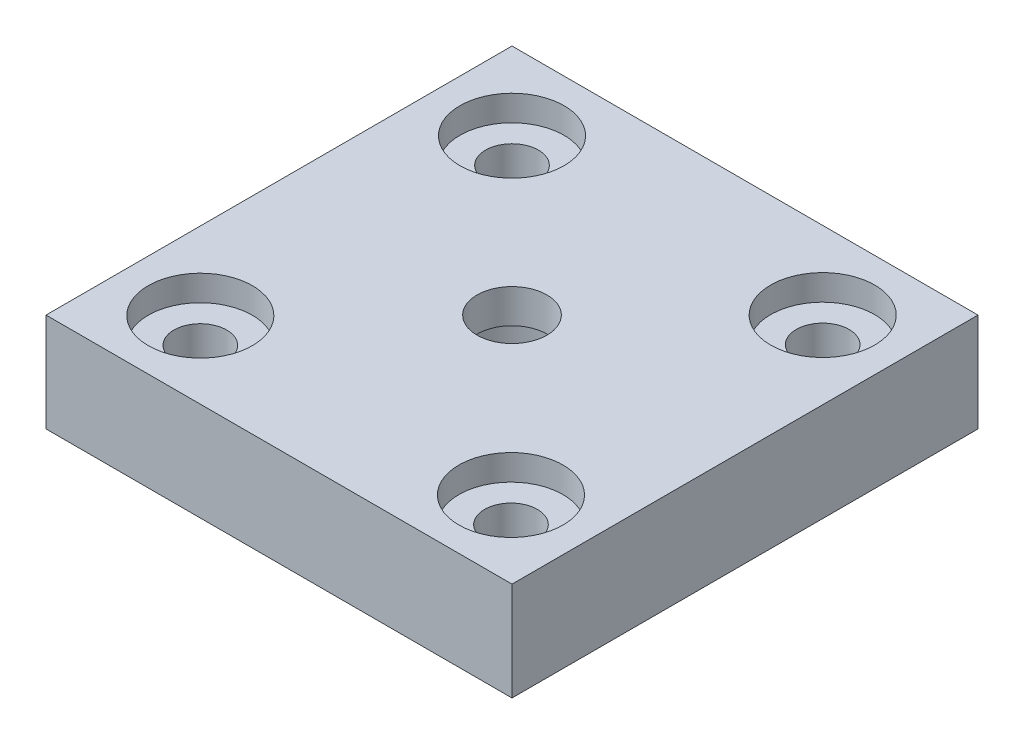
ISO-10303-21;
HEADER;
FILE_DESCRIPTION(('STEP AP214'),'2;1');
FILE_NAME('part.step','',(''),(''),'','','');
FILE_SCHEMA(('AUTOMOTIVE_DESIGN { 1 0 10303 214 1 1 1 1 }'));
ENDSEC;
DATA;
#1=APPLICATION_CONTEXT('core data for automotive mechanical design processes');
#2=APPLICATION_PROTOCOL_DEFINITION('international standard','automotive_design',2000,#1);
#3=PRODUCT_CONTEXT('',#1,'mechanical');
#4=PRODUCT('Part','Part','',(#3));
#5=PRODUCT_RELATED_PRODUCT_CATEGORY('part','',(#4));
#6=PRODUCT_DEFINITION_FORMATION('','',#4);
#7=PRODUCT_DEFINITION_CONTEXT('part definition',#1,'design');
#8=PRODUCT_DEFINITION('design','',#6,#7);
#9=PRODUCT_DEFINITION_SHAPE('','',#8);
#10=(LENGTH_UNIT() NAMED_UNIT(*) SI_UNIT(.MILLI.,.METRE.));
#11=(NAMED_UNIT(*) PLANE_ANGLE_UNIT() SI_UNIT($,.RADIAN.));
#12=(NAMED_UNIT(*) SI_UNIT($,.STERADIAN.) SOLID_ANGLE_UNIT());
#13=UNCERTAINTY_MEASURE_WITH_UNIT(LENGTH_MEASURE(1.E-05),#10,'distance_accuracy_value','');
#14=(GEOMETRIC_REPRESENTATION_CONTEXT(3) GLOBAL_UNCERTAINTY_ASSIGNED_CONTEXT((#13)) GLOBAL_UNIT_ASSIGNED_CONTEXT((#10,
#11,#12)) REPRESENTATION_CONTEXT('',''));
#15=CARTESIAN_POINT('',(0.,0.,0.));
#16=DIRECTION('',(0.,0.,1.));
#17=DIRECTION('',(1.,0.,0.));
#18=AXIS2_PLACEMENT_3D('',#15,#16,#17);
#19=CARTESIAN_POINT('',(0.,6.35,0.));
#20=DIRECTION('',(0.,-1.,0.));
#21=DIRECTION('',(0.,0.,-1.));
#22=AXIS2_PLACEMENT_3D('',#19,#20,#21);
#23=PLANE('',#22);
#24=CARTESIAN_POINT('',(0.,6.35,0.));
#25=DIRECTION('',(0.,-1.,0.));
#26=DIRECTION('',(0.,0.,-1.));
#27=AXIS2_PLACEMENT_3D('',#24,#25,#26);
#28=CIRCLE('',#27,2.2479);
#29=CARTESIAN_POINT('',(0.,6.35,-2.2479));
#30=VERTEX_POINT('',#29);
#31=EDGE_CURVE('E193',#30,#30,#28,.T.);
#32=ORIENTED_EDGE('',*,*,#31,.T.);
#33=EDGE_LOOP('',(#32));
#34=FACE_BOUND('',#33,.T.);
#35=CARTESIAN_POINT('',(10.,6.35,-10.));
#36=DIRECTION('',(0.,1.,0.));
#37=DIRECTION('',(0.,0.,1.));
#38=AXIS2_PLACEMENT_3D('',#35,#36,#37);
#39=CIRCLE('',#38,3.35);
#40=CARTESIAN_POINT('',(10.,6.35,-6.65));
#41=VERTEX_POINT('',#40);
#42=EDGE_CURVE('E173',#41,#41,#39,.T.);
#43=ORIENTED_EDGE('',*,*,#42,.F.);
#44=EDGE_LOOP('',(#43));
#45=FACE_BOUND('',#44,.T.);
#46=CARTESIAN_POINT('',(-9.99999999999979,6.35,10.066));
#47=DIRECTION('',(0.,1.,0.));
#48=DIRECTION('',(0.,0.,1.));
#49=AXIS2_PLACEMENT_3D('',#46,#47,#48);
#50=CIRCLE('',#49,3.35);
#51=CARTESIAN_POINT('',(-9.99999999999979,6.35,13.416));
#52=VERTEX_POINT('',#51);
#53=EDGE_CURVE('E141',#52,#52,#50,.T.);
#54=ORIENTED_EDGE('',*,*,#53,.F.);
#55=EDGE_LOOP('',(#54));
#56=FACE_BOUND('',#55,.T.);
#57=DIRECTION('',(0.,0.,1.));
#58=VECTOR('',#57,1.);
#59=CARTESIAN_POINT('',(-15.,6.35,15.));
#60=LINE('',#59,#58);
#61=CARTESIAN_POINT('',(-15.,6.35,-15.));
#62=VERTEX_POINT('',#61);
#63=CARTESIAN_POINT('',(-15.,6.35,15.));
#64=VERTEX_POINT('',#63);
#65=EDGE_CURVE('E92',#62,#64,#60,.T.);
#66=ORIENTED_EDGE('',*,*,#65,.T.);
#67=DIRECTION('',(1.,0.,0.));
#68=VECTOR('',#67,1.);
#69=CARTESIAN_POINT('',(-15.,6.35,15.));
#70=LINE('',#69,#68);
#71=CARTESIAN_POINT('',(15.,6.35,15.));
#72=VERTEX_POINT('',#71);
#73=EDGE_CURVE('E87',#64,#72,#70,.T.);
#74=ORIENTED_EDGE('',*,*,#73,.T.);
#75=DIRECTION('',(0.,0.,-1.));
#76=VECTOR('',#75,1.);
#77=CARTESIAN_POINT('',(15.,6.35,15.));
#78=LINE('',#77,#76);
#79=CARTESIAN_POINT('',(15.,6.35,-15.));
#80=VERTEX_POINT('',#79);
#81=EDGE_CURVE('E90',#72,#80,#78,.T.);
#82=ORIENTED_EDGE('',*,*,#81,.T.);
#83=DIRECTION('',(-1.,0.,0.));
#84=VECTOR('',#83,1.);
#85=CARTESIAN_POINT('',(-15.,6.35,-15.));
#86=LINE('',#85,#84);
#87=EDGE_CURVE('E57',#80,#62,#86,.T.);
#88=ORIENTED_EDGE('',*,*,#87,.T.);
#89=EDGE_LOOP('',(#66,#74,#82,#88));
#90=FACE_BOUND('',#89,.T.);
#91=CARTESIAN_POINT('',(10.0000000000002,6.35,10.066));
#92=DIRECTION('',(0.,1.,0.));
#93=DIRECTION('',(0.,0.,1.));
#94=AXIS2_PLACEMENT_3D('',#91,#92,#93);
#95=CIRCLE('',#94,3.35);
#96=CARTESIAN_POINT('',(10.0000000000002,6.35,13.416));
#97=VERTEX_POINT('',#96);
#98=EDGE_CURVE('E157',#97,#97,#95,.T.);
#99=ORIENTED_EDGE('',*,*,#98,.F.);
#100=EDGE_LOOP('',(#99));
#101=FACE_BOUND('',#100,.T.);
#102=CARTESIAN_POINT('',(-10.,6.35,-10.));
#103=DIRECTION('',(0.,1.,0.));
#104=DIRECTION('',(0.,0.,1.));
#105=AXIS2_PLACEMENT_3D('',#102,#103,#104);
#106=CIRCLE('',#105,3.35);
#107=CARTESIAN_POINT('',(-10.,6.35,-6.65));
#108=VERTEX_POINT('',#107);
#109=EDGE_CURVE('E189',#108,#108,#106,.T.);
#110=ORIENTED_EDGE('',*,*,#109,.F.);
#111=EDGE_LOOP('',(#110));
#112=FACE_BOUND('',#111,.T.);
#113=ADVANCED_FACE('F39',(#34,#45,#56,#90,#101,#112),#23,.F.);
#114=CARTESIAN_POINT('',(0.,0.,0.));
#115=DIRECTION('',(0.,-1.,0.));
#116=DIRECTION('',(0.,0.,-1.));
#117=AXIS2_PLACEMENT_3D('',#114,#115,#116);
#118=PLANE('',#117);
#119=CARTESIAN_POINT('',(0.,0.,0.));
#120=DIRECTION('',(0.,-1.,0.));
#121=DIRECTION('',(0.,0.,-1.));
#122=AXIS2_PLACEMENT_3D('',#119,#120,#121);
#123=CIRCLE('',#122,3.96875);
#124=CARTESIAN_POINT('',(0.,0.,-3.96875));
#125=VERTEX_POINT('',#124);
#126=EDGE_CURVE('E205',#125,#125,#123,.T.);
#127=ORIENTED_EDGE('',*,*,#126,.F.);
#128=EDGE_LOOP('',(#127));
#129=FACE_BOUND('',#128,.T.);
#130=DIRECTION('',(0.,0.,1.));
#131=VECTOR('',#130,1.);
#132=CARTESIAN_POINT('',(-15.,0.,15.));
#133=LINE('',#132,#131);
#134=CARTESIAN_POINT('',(-15.,0.,-15.));
#135=VERTEX_POINT('',#134);
#136=CARTESIAN_POINT('',(-15.,0.,15.));
#137=VERTEX_POINT('',#136);
#138=EDGE_CURVE('E108',#135,#137,#133,.T.);
#139=ORIENTED_EDGE('',*,*,#138,.F.);
#140=DIRECTION('',(-1.,0.,0.));
#141=VECTOR('',#140,1.);
#142=CARTESIAN_POINT('',(-15.,0.,-15.));
#143=LINE('',#142,#141);
#144=CARTESIAN_POINT('',(15.,0.,-15.));
#145=VERTEX_POINT('',#144);
#146=EDGE_CURVE('E80',#145,#135,#143,.T.);
#147=ORIENTED_EDGE('',*,*,#146,.F.);
#148=DIRECTION('',(0.,0.,-1.));
#149=VECTOR('',#148,1.);
#150=CARTESIAN_POINT('',(15.,0.,15.));
#151=LINE('',#150,#149);
#152=CARTESIAN_POINT('',(15.,0.,15.));
#153=VERTEX_POINT('',#152);
#154=EDGE_CURVE('E74',#153,#145,#151,.T.);
#155=ORIENTED_EDGE('',*,*,#154,.F.);
#156=DIRECTION('',(1.,0.,0.));
#157=VECTOR('',#156,1.);
#158=CARTESIAN_POINT('',(-15.,0.,15.));
#159=LINE('',#158,#157);
#160=EDGE_CURVE('E97',#137,#153,#159,.T.);
#161=ORIENTED_EDGE('',*,*,#160,.F.);
#162=EDGE_LOOP('',(#139,#147,#155,#161));
#163=FACE_BOUND('',#162,.T.);
#164=CARTESIAN_POINT('',(-9.99999999999979,0.,10.066));
#165=DIRECTION('',(0.,1.,0.));
#166=DIRECTION('',(0.,0.,1.));
#167=AXIS2_PLACEMENT_3D('',#164,#165,#166);
#168=CIRCLE('',#167,1.7);
#169=CARTESIAN_POINT('',(-9.99999999999979,0.,11.766));
#170=VERTEX_POINT('',#169);
#171=EDGE_CURVE('E112',#170,#170,#168,.T.);
#172=ORIENTED_EDGE('',*,*,#171,.T.);
#173=EDGE_LOOP('',(#172));
#174=FACE_BOUND('',#173,.T.);
#175=CARTESIAN_POINT('',(10.0000000000002,0.,10.066));
#176=DIRECTION('',(0.,1.,0.));
#177=DIRECTION('',(0.,0.,1.));
#178=AXIS2_PLACEMENT_3D('',#175,#176,#177);
#179=CIRCLE('',#178,1.7);
#180=CARTESIAN_POINT('',(10.0000000000002,0.,11.766));
#181=VERTEX_POINT('',#180);
#182=EDGE_CURVE('E145',#181,#181,#179,.T.);
#183=ORIENTED_EDGE('',*,*,#182,.T.);
#184=EDGE_LOOP('',(#183));
#185=FACE_BOUND('',#184,.T.);
#186=CARTESIAN_POINT('',(10.,0.,-10.));
#187=DIRECTION('',(0.,1.,0.));
#188=DIRECTION('',(0.,0.,1.));
#189=AXIS2_PLACEMENT_3D('',#186,#187,#188);
#190=CIRCLE('',#189,1.7);
#191=CARTESIAN_POINT('',(10.,0.,-8.3));
#192=VERTEX_POINT('',#191);
#193=EDGE_CURVE('E161',#192,#192,#190,.T.);
#194=ORIENTED_EDGE('',*,*,#193,.T.);
#195=EDGE_LOOP('',(#194));
#196=FACE_BOUND('',#195,.T.);
#197=CARTESIAN_POINT('',(-10.,0.,-10.));
#198=DIRECTION('',(0.,1.,0.));
#199=DIRECTION('',(0.,0.,1.));
#200=AXIS2_PLACEMENT_3D('',#197,#198,#199);
#201=CIRCLE('',#200,1.7);
#202=CARTESIAN_POINT('',(-10.,0.,-8.3));
#203=VERTEX_POINT('',#202);
#204=EDGE_CURVE('E177',#203,#203,#201,.T.);
#205=ORIENTED_EDGE('',*,*,#204,.T.);
#206=EDGE_LOOP('',(#205));
#207=FACE_BOUND('',#206,.T.);
#208=ADVANCED_FACE('F125',(#129,#163,#174,#185,#196,#207),#118,.T.);
#209=CARTESIAN_POINT('',(-15.,6.35,15.));
#210=DIRECTION('',(1.,0.,0.));
#211=DIRECTION('',(0.,0.,-1.));
#212=AXIS2_PLACEMENT_3D('',#209,#210,#211);
#213=PLANE('',#212);
#214=ORIENTED_EDGE('',*,*,#138,.T.);
#215=DIRECTION('',(0.,-1.,0.));
#216=VECTOR('',#215,1.);
#217=CARTESIAN_POINT('',(-15.,6.35,15.));
#218=LINE('',#217,#216);
#219=EDGE_CURVE('E11',#64,#137,#218,.T.);
#220=ORIENTED_EDGE('',*,*,#219,.F.);
#221=ORIENTED_EDGE('',*,*,#65,.F.);
#222=DIRECTION('',(0.,-1.,0.));
#223=VECTOR('',#222,1.);
#224=CARTESIAN_POINT('',(-15.,6.35,-15.));
#225=LINE('',#224,#223);
#226=EDGE_CURVE('E104',#62,#135,#225,.T.);
#227=ORIENTED_EDGE('',*,*,#226,.T.);
#228=EDGE_LOOP('',(#214,#220,#221,#227));
#229=FACE_BOUND('',#228,.T.);
#230=ADVANCED_FACE('F41',(#229),#213,.F.);
#231=CARTESIAN_POINT('',(-15.,6.35,15.));
#232=DIRECTION('',(0.,0.,-1.));
#233=DIRECTION('',(-1.,0.,0.));
#234=AXIS2_PLACEMENT_3D('',#231,#232,#233);
#235=PLANE('',#234);
#236=ORIENTED_EDGE('',*,*,#160,.T.);
#237=DIRECTION('',(0.,-1.,0.));
#238=VECTOR('',#237,1.);
#239=CARTESIAN_POINT('',(15.,6.35,15.));
#240=LINE('',#239,#238);
#241=EDGE_CURVE('E49',#72,#153,#240,.T.);
#242=ORIENTED_EDGE('',*,*,#241,.F.);
#243=ORIENTED_EDGE('',*,*,#73,.F.);
#244=ORIENTED_EDGE('',*,*,#219,.T.);
#245=EDGE_LOOP('',(#236,#242,#243,#244));
#246=FACE_BOUND('',#245,.T.);
#247=ADVANCED_FACE('F96',(#246),#235,.F.);
#248=CARTESIAN_POINT('',(15.,6.35,15.));
#249=DIRECTION('',(-1.,0.,0.));
#250=DIRECTION('',(0.,0.,1.));
#251=AXIS2_PLACEMENT_3D('',#248,#249,#250);
#252=PLANE('',#251);
#253=ORIENTED_EDGE('',*,*,#154,.T.);
#254=DIRECTION('',(0.,-1.,0.));
#255=VECTOR('',#254,1.);
#256=CARTESIAN_POINT('',(15.,6.35,-15.));
#257=LINE('',#256,#255);
#258=EDGE_CURVE('E99',#80,#145,#257,.T.);
#259=ORIENTED_EDGE('',*,*,#258,.F.);
#260=ORIENTED_EDGE('',*,*,#81,.F.);
#261=ORIENTED_EDGE('',*,*,#241,.T.);
#262=EDGE_LOOP('',(#253,#259,#260,#261));
#263=FACE_BOUND('',#262,.T.);
#264=ADVANCED_FACE('F100',(#263),#252,.F.);
#265=CARTESIAN_POINT('',(-15.,6.35,-15.));
#266=DIRECTION('',(0.,0.,1.));
#267=DIRECTION('',(1.,0.,0.));
#268=AXIS2_PLACEMENT_3D('',#265,#266,#267);
#269=PLANE('',#268);
#270=ORIENTED_EDGE('',*,*,#146,.T.);
#271=ORIENTED_EDGE('',*,*,#226,.F.);
#272=ORIENTED_EDGE('',*,*,#87,.F.);
#273=ORIENTED_EDGE('',*,*,#258,.T.);
#274=EDGE_LOOP('',(#270,#271,#272,#273));
#275=FACE_BOUND('',#274,.T.);
#276=ADVANCED_FACE('F122',(#275),#269,.F.);
#277=CARTESIAN_POINT('',(-9.99999999999979,6.35,10.066));
#278=DIRECTION('',(0.,1.,0.));
#279=DIRECTION('',(0.,0.,1.));
#280=AXIS2_PLACEMENT_3D('',#277,#278,#279);
#281=CYLINDRICAL_SURFACE('',#280,1.7);
#282=ORIENTED_EDGE('',*,*,#171,.F.);
#283=EDGE_LOOP('',(#282));
#284=FACE_BOUND('',#283,.T.);
#285=CARTESIAN_POINT('',(-9.99999999999979,4.7,10.066));
#286=DIRECTION('',(0.,1.,0.));
#287=DIRECTION('',(0.,0.,1.));
#288=AXIS2_PLACEMENT_3D('',#285,#286,#287);
#289=CIRCLE('',#288,1.7);
#290=CARTESIAN_POINT('',(-9.99999999999979,4.7,11.766));
#291=VERTEX_POINT('',#290);
#292=EDGE_CURVE('E133',#291,#291,#289,.T.);
#293=ORIENTED_EDGE('',*,*,#292,.T.);
#294=EDGE_LOOP('',(#293));
#295=FACE_BOUND('',#294,.T.);
#296=ADVANCED_FACE('F224',(#284,#295),#281,.F.);
#297=CARTESIAN_POINT('',(-8.29999999999979,4.7,10.066));
#298=DIRECTION('',(0.,-1.,0.));
#299=DIRECTION('',(0.,0.,-1.));
#300=AXIS2_PLACEMENT_3D('',#297,#298,#299);
#301=PLANE('',#300);
#302=ORIENTED_EDGE('',*,*,#292,.F.);
#303=EDGE_LOOP('',(#302));
#304=FACE_BOUND('',#303,.T.);
#305=CARTESIAN_POINT('',(-9.99999999999979,4.7,10.066));
#306=DIRECTION('',(0.,1.,0.));
#307=DIRECTION('',(0.,0.,1.));
#308=AXIS2_PLACEMENT_3D('',#305,#306,#307);
#309=CIRCLE('',#308,3.35);
#310=CARTESIAN_POINT('',(-9.99999999999979,4.7,13.416));
#311=VERTEX_POINT('',#310);
#312=EDGE_CURVE('E137',#311,#311,#309,.T.);
#313=ORIENTED_EDGE('',*,*,#312,.T.);
#314=EDGE_LOOP('',(#313));
#315=FACE_BOUND('',#314,.T.);
#316=ADVANCED_FACE('F245',(#304,#315),#301,.F.);
#317=CARTESIAN_POINT('',(-9.99999999999979,6.35,10.066));
#318=DIRECTION('',(0.,1.,0.));
#319=DIRECTION('',(0.,0.,1.));
#320=AXIS2_PLACEMENT_3D('',#317,#318,#319);
#321=CYLINDRICAL_SURFACE('',#320,3.35);
#322=ORIENTED_EDGE('',*,*,#312,.F.);
#323=EDGE_LOOP('',(#322));
#324=FACE_BOUND('',#323,.T.);
#325=ORIENTED_EDGE('',*,*,#53,.T.);
#326=EDGE_LOOP('',(#325));
#327=FACE_BOUND('',#326,.T.);
#328=ADVANCED_FACE('F252',(#324,#327),#321,.F.);
#329=CARTESIAN_POINT('',(10.0000000000002,6.35,10.066));
#330=DIRECTION('',(0.,1.,0.));
#331=DIRECTION('',(0.,0.,1.));
#332=AXIS2_PLACEMENT_3D('',#329,#330,#331);
#333=CYLINDRICAL_SURFACE('',#332,1.7);
#334=ORIENTED_EDGE('',*,*,#182,.F.);
#335=EDGE_LOOP('',(#334));
#336=FACE_BOUND('',#335,.T.);
#337=CARTESIAN_POINT('',(10.0000000000002,4.7,10.066));
#338=DIRECTION('',(0.,1.,0.));
#339=DIRECTION('',(0.,0.,1.));
#340=AXIS2_PLACEMENT_3D('',#337,#338,#339);
#341=CIRCLE('',#340,1.7);
#342=CARTESIAN_POINT('',(10.0000000000002,4.7,11.766));
#343=VERTEX_POINT('',#342);
#344=EDGE_CURVE('E149',#343,#343,#341,.T.);
#345=ORIENTED_EDGE('',*,*,#344,.T.);
#346=EDGE_LOOP('',(#345));
#347=FACE_BOUND('',#346,.T.);
#348=ADVANCED_FACE('F260',(#336,#347),#333,.F.);
#349=CARTESIAN_POINT('',(11.7000000000002,4.7,10.066));
#350=DIRECTION('',(0.,-1.,0.));
#351=DIRECTION('',(0.,0.,-1.));
#352=AXIS2_PLACEMENT_3D('',#349,#350,#351);
#353=PLANE('',#352);
#354=ORIENTED_EDGE('',*,*,#344,.F.);
#355=EDGE_LOOP('',(#354));
#356=FACE_BOUND('',#355,.T.);
#357=CARTESIAN_POINT('',(10.0000000000002,4.7,10.066));
#358=DIRECTION('',(0.,1.,0.));
#359=DIRECTION('',(0.,0.,1.));
#360=AXIS2_PLACEMENT_3D('',#357,#358,#359);
#361=CIRCLE('',#360,3.35);
#362=CARTESIAN_POINT('',(10.0000000000002,4.7,13.416));
#363=VERTEX_POINT('',#362);
#364=EDGE_CURVE('E153',#363,#363,#361,.T.);
#365=ORIENTED_EDGE('',*,*,#364,.T.);
#366=EDGE_LOOP('',(#365));
#367=FACE_BOUND('',#366,.T.);
#368=ADVANCED_FACE('F268',(#356,#367),#353,.F.);
#369=CARTESIAN_POINT('',(10.0000000000002,6.35,10.066));
#370=DIRECTION('',(0.,1.,0.));
#371=DIRECTION('',(0.,0.,1.));
#372=AXIS2_PLACEMENT_3D('',#369,#370,#371);
#373=CYLINDRICAL_SURFACE('',#372,3.35);
#374=ORIENTED_EDGE('',*,*,#364,.F.);
#375=EDGE_LOOP('',(#374));
#376=FACE_BOUND('',#375,.T.);
#377=ORIENTED_EDGE('',*,*,#98,.T.);
#378=EDGE_LOOP('',(#377));
#379=FACE_BOUND('',#378,.T.);
#380=ADVANCED_FACE('F276',(#376,#379),#373,.F.);
#381=CARTESIAN_POINT('',(10.,6.35,-10.));
#382=DIRECTION('',(0.,1.,0.));
#383=DIRECTION('',(0.,0.,1.));
#384=AXIS2_PLACEMENT_3D('',#381,#382,#383);
#385=CYLINDRICAL_SURFACE('',#384,1.7);
#386=ORIENTED_EDGE('',*,*,#193,.F.);
#387=EDGE_LOOP('',(#386));
#388=FACE_BOUND('',#387,.T.);
#389=CARTESIAN_POINT('',(10.,4.7,-10.));
#390=DIRECTION('',(0.,1.,0.));
#391=DIRECTION('',(0.,0.,1.));
#392=AXIS2_PLACEMENT_3D('',#389,#390,#391);
#393=CIRCLE('',#392,1.7);
#394=CARTESIAN_POINT('',(10.,4.7,-8.3));
#395=VERTEX_POINT('',#394);
#396=EDGE_CURVE('E165',#395,#395,#393,.T.);
#397=ORIENTED_EDGE('',*,*,#396,.T.);
#398=EDGE_LOOP('',(#397));
#399=FACE_BOUND('',#398,.T.);
#400=ADVANCED_FACE('F284',(#388,#399),#385,.F.);
#401=CARTESIAN_POINT('',(11.7,4.7,-10.));
#402=DIRECTION('',(0.,-1.,0.));
#403=DIRECTION('',(0.,0.,-1.));
#404=AXIS2_PLACEMENT_3D('',#401,#402,#403);
#405=PLANE('',#404);
#406=ORIENTED_EDGE('',*,*,#396,.F.);
#407=EDGE_LOOP('',(#406));
#408=FACE_BOUND('',#407,.T.);
#409=CARTESIAN_POINT('',(10.,4.7,-10.));
#410=DIRECTION('',(0.,1.,0.));
#411=DIRECTION('',(0.,0.,1.));
#412=AXIS2_PLACEMENT_3D('',#409,#410,#411);
#413=CIRCLE('',#412,3.35);
#414=CARTESIAN_POINT('',(10.,4.7,-6.65));
#415=VERTEX_POINT('',#414);
#416=EDGE_CURVE('E169',#415,#415,#413,.T.);
#417=ORIENTED_EDGE('',*,*,#416,.T.);
#418=EDGE_LOOP('',(#417));
#419=FACE_BOUND('',#418,.T.);
#420=ADVANCED_FACE('F292',(#408,#419),#405,.F.);
#421=CARTESIAN_POINT('',(10.,6.35,-10.));
#422=DIRECTION('',(0.,1.,0.));
#423=DIRECTION('',(0.,0.,1.));
#424=AXIS2_PLACEMENT_3D('',#421,#422,#423);
#425=CYLINDRICAL_SURFACE('',#424,3.35);
#426=ORIENTED_EDGE('',*,*,#416,.F.);
#427=EDGE_LOOP('',(#426));
#428=FACE_BOUND('',#427,.T.);
#429=ORIENTED_EDGE('',*,*,#42,.T.);
#430=EDGE_LOOP('',(#429));
#431=FACE_BOUND('',#430,.T.);
#432=ADVANCED_FACE('F300',(#428,#431),#425,.F.);
#433=CARTESIAN_POINT('',(-10.,6.35,-10.));
#434=DIRECTION('',(0.,1.,0.));
#435=DIRECTION('',(0.,0.,1.));
#436=AXIS2_PLACEMENT_3D('',#433,#434,#435);
#437=CYLINDRICAL_SURFACE('',#436,1.7);
#438=ORIENTED_EDGE('',*,*,#204,.F.);
#439=EDGE_LOOP('',(#438));
#440=FACE_BOUND('',#439,.T.);
#441=CARTESIAN_POINT('',(-10.,4.7,-10.));
#442=DIRECTION('',(0.,1.,0.));
#443=DIRECTION('',(0.,0.,1.));
#444=AXIS2_PLACEMENT_3D('',#441,#442,#443);
#445=CIRCLE('',#444,1.7);
#446=CARTESIAN_POINT('',(-10.,4.7,-8.3));
#447=VERTEX_POINT('',#446);
#448=EDGE_CURVE('E181',#447,#447,#445,.T.);
#449=ORIENTED_EDGE('',*,*,#448,.T.);
#450=EDGE_LOOP('',(#449));
#451=FACE_BOUND('',#450,.T.);
#452=ADVANCED_FACE('F308',(#440,#451),#437,.F.);
#453=CARTESIAN_POINT('',(-8.3,4.7,-10.));
#454=DIRECTION('',(0.,-1.,0.));
#455=DIRECTION('',(0.,0.,-1.));
#456=AXIS2_PLACEMENT_3D('',#453,#454,#455);
#457=PLANE('',#456);
#458=ORIENTED_EDGE('',*,*,#448,.F.);
#459=EDGE_LOOP('',(#458));
#460=FACE_BOUND('',#459,.T.);
#461=CARTESIAN_POINT('',(-10.,4.7,-10.));
#462=DIRECTION('',(0.,1.,0.));
#463=DIRECTION('',(0.,0.,1.));
#464=AXIS2_PLACEMENT_3D('',#461,#462,#463);
#465=CIRCLE('',#464,3.35);
#466=CARTESIAN_POINT('',(-10.,4.7,-6.65));
#467=VERTEX_POINT('',#466);
#468=EDGE_CURVE('E185',#467,#467,#465,.T.);
#469=ORIENTED_EDGE('',*,*,#468,.T.);
#470=EDGE_LOOP('',(#469));
#471=FACE_BOUND('',#470,.T.);
#472=ADVANCED_FACE('F316',(#460,#471),#457,.F.);
#473=CARTESIAN_POINT('',(-10.,6.35,-10.));
#474=DIRECTION('',(0.,1.,0.));
#475=DIRECTION('',(0.,0.,1.));
#476=AXIS2_PLACEMENT_3D('',#473,#474,#475);
#477=CYLINDRICAL_SURFACE('',#476,3.35);
#478=ORIENTED_EDGE('',*,*,#468,.F.);
#479=EDGE_LOOP('',(#478));
#480=FACE_BOUND('',#479,.T.);
#481=ORIENTED_EDGE('',*,*,#109,.T.);
#482=EDGE_LOOP('',(#481));
#483=FACE_BOUND('',#482,.T.);
#484=ADVANCED_FACE('F324',(#480,#483),#477,.F.);
#485=CARTESIAN_POINT('',(0.,0.,0.));
#486=DIRECTION('',(0.,-1.,0.));
#487=DIRECTION('',(0.,0.,-1.));
#488=AXIS2_PLACEMENT_3D('',#485,#486,#487);
#489=CYLINDRICAL_SURFACE('',#488,2.2479);
#490=ORIENTED_EDGE('',*,*,#31,.F.);
#491=EDGE_LOOP('',(#490));
#492=FACE_BOUND('',#491,.T.);
#493=CARTESIAN_POINT('',(0.,4.1656,0.));
#494=DIRECTION('',(0.,-1.,0.));
#495=DIRECTION('',(0.,0.,-1.));
#496=AXIS2_PLACEMENT_3D('',#493,#494,#495);
#497=CIRCLE('',#496,2.2479);
#498=CARTESIAN_POINT('',(0.,4.1656,-2.2479));
#499=VERTEX_POINT('',#498);
#500=EDGE_CURVE('E197',#499,#499,#497,.T.);
#501=ORIENTED_EDGE('',*,*,#500,.T.);
#502=EDGE_LOOP('',(#501));
#503=FACE_BOUND('',#502,.T.);
#504=ADVANCED_FACE('F332',(#492,#503),#489,.F.);
#505=CARTESIAN_POINT('',(2.2479,4.1656,0.));
#506=DIRECTION('',(0.,1.,0.));
#507=DIRECTION('',(0.,0.,1.));
#508=AXIS2_PLACEMENT_3D('',#505,#506,#507);
#509=PLANE('',#508);
#510=ORIENTED_EDGE('',*,*,#500,.F.);
#511=EDGE_LOOP('',(#510));
#512=FACE_BOUND('',#511,.T.);
#513=CARTESIAN_POINT('',(0.,4.1656,0.));
#514=DIRECTION('',(0.,-1.,0.));
#515=DIRECTION('',(0.,0.,-1.));
#516=AXIS2_PLACEMENT_3D('',#513,#514,#515);
#517=CIRCLE('',#516,3.96875);
#518=CARTESIAN_POINT('',(0.,4.1656,-3.96875));
#519=VERTEX_POINT('',#518);
#520=EDGE_CURVE('E201',#519,#519,#517,.T.);
#521=ORIENTED_EDGE('',*,*,#520,.T.);
#522=EDGE_LOOP('',(#521));
#523=FACE_BOUND('',#522,.T.);
#524=ADVANCED_FACE('F341',(#512,#523),#509,.F.);
#525=CARTESIAN_POINT('',(0.,0.,0.));
#526=DIRECTION('',(0.,-1.,0.));
#527=DIRECTION('',(0.,0.,-1.));
#528=AXIS2_PLACEMENT_3D('',#525,#526,#527);
#529=CYLINDRICAL_SURFACE('',#528,3.96875);
#530=ORIENTED_EDGE('',*,*,#520,.F.);
#531=EDGE_LOOP('',(#530));
#532=FACE_BOUND('',#531,.T.);
#533=ORIENTED_EDGE('',*,*,#126,.T.);
#534=EDGE_LOOP('',(#533));
#535=FACE_BOUND('',#534,.T.);
#536=ADVANCED_FACE('F210',(#532,#535),#529,.F.);
#537=CLOSED_SHELL('',(#113,#208,#230,#247,#264,#276,#296,#316,#328,#348,#368,#380,#400,#420,
#432,#452,#472,#484,#504,#524,#536));
#538=MANIFOLD_SOLID_BREP('B2',#537);
#539=ADVANCED_BREP_SHAPE_REPRESENTATION('',(#18,#538),#14);
#540=SHAPE_DEFINITION_REPRESENTATION(#9,#539);
ENDSEC;
END-ISO-10303-21;
